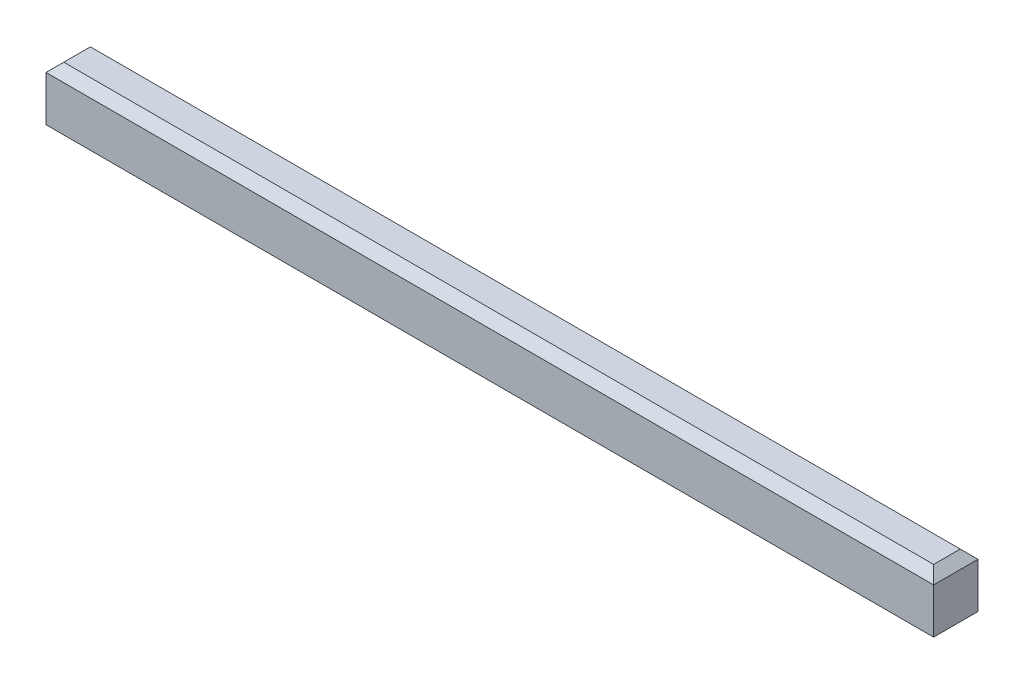
ISO-10303-21;
HEADER;
FILE_DESCRIPTION(('STEP AP214'),'2;1');
FILE_NAME('part.step','',(''),(''),'','','');
FILE_SCHEMA(('AUTOMOTIVE_DESIGN { 1 0 10303 214 1 1 1 1 }'));
ENDSEC;
DATA;
#1=APPLICATION_CONTEXT('core data for automotive mechanical design processes');
#2=APPLICATION_PROTOCOL_DEFINITION('international standard','automotive_design',2000,#1);
#3=PRODUCT_CONTEXT('',#1,'mechanical');
#4=PRODUCT('Part','Part','',(#3));
#5=PRODUCT_RELATED_PRODUCT_CATEGORY('part','',(#4));
#6=PRODUCT_DEFINITION_FORMATION('','',#4);
#7=PRODUCT_DEFINITION_CONTEXT('part definition',#1,'design');
#8=PRODUCT_DEFINITION('design','',#6,#7);
#9=PRODUCT_DEFINITION_SHAPE('','',#8);
#10=(LENGTH_UNIT() NAMED_UNIT(*) SI_UNIT(.MILLI.,.METRE.));
#11=(NAMED_UNIT(*) PLANE_ANGLE_UNIT() SI_UNIT($,.RADIAN.));
#12=(NAMED_UNIT(*) SI_UNIT($,.STERADIAN.) SOLID_ANGLE_UNIT());
#13=UNCERTAINTY_MEASURE_WITH_UNIT(LENGTH_MEASURE(1.E-05),#10,'distance_accuracy_value','');
#14=(GEOMETRIC_REPRESENTATION_CONTEXT(3) GLOBAL_UNCERTAINTY_ASSIGNED_CONTEXT((#13)) GLOBAL_UNIT_ASSIGNED_CONTEXT((#10,
#11,#12)) REPRESENTATION_CONTEXT('',''));
#15=CARTESIAN_POINT('',(0.,0.,0.));
#16=DIRECTION('',(0.,0.,1.));
#17=DIRECTION('',(1.,0.,0.));
#18=AXIS2_PLACEMENT_3D('',#15,#16,#17);
#19=CARTESIAN_POINT('',(0.,0.,2.5));
#20=DIRECTION('',(1.,0.,0.));
#21=DIRECTION('',(0.,0.,-1.));
#22=AXIS2_PLACEMENT_3D('',#19,#20,#21);
#23=PLANE('',#22);
#24=DIRECTION('',(0.,-1.,0.));
#25=VECTOR('',#24,1.);
#26=CARTESIAN_POINT('',(0.,0.,2.5));
#27=LINE('',#26,#25);
#28=CARTESIAN_POINT('',(0.,5.1,2.5));
#29=VERTEX_POINT('',#28);
#30=CARTESIAN_POINT('',(0.,0.,2.5));
#31=VERTEX_POINT('',#30);
#32=EDGE_CURVE('E84',#29,#31,#27,.T.);
#33=ORIENTED_EDGE('',*,*,#32,.F.);
#34=DIRECTION('',(0.,0.,-1.));
#35=VECTOR('',#34,1.);
#36=CARTESIAN_POINT('',(0.,5.1,2.5));
#37=LINE('',#36,#35);
#38=CARTESIAN_POINT('',(0.,5.1,-2.5));
#39=VERTEX_POINT('',#38);
#40=EDGE_CURVE('E42',#29,#39,#37,.T.);
#41=ORIENTED_EDGE('',*,*,#40,.T.);
#42=DIRECTION('',(0.,-1.,0.));
#43=VECTOR('',#42,1.);
#44=CARTESIAN_POINT('',(0.,0.,-2.5));
#45=LINE('',#44,#43);
#46=CARTESIAN_POINT('',(0.,0.,-2.5));
#47=VERTEX_POINT('',#46);
#48=EDGE_CURVE('E101',#39,#47,#45,.T.);
#49=ORIENTED_EDGE('',*,*,#48,.T.);
#50=DIRECTION('',(0.,0.,-1.));
#51=VECTOR('',#50,1.);
#52=CARTESIAN_POINT('',(0.,0.,2.5));
#53=LINE('',#52,#51);
#54=EDGE_CURVE('E95',#31,#47,#53,.T.);
#55=ORIENTED_EDGE('',*,*,#54,.F.);
#56=EDGE_LOOP('',(#33,#41,#49,#55));
#57=FACE_BOUND('',#56,.T.);
#58=ADVANCED_FACE('F33',(#57),#23,.F.);
#59=CARTESIAN_POINT('',(0.,0.,2.5));
#60=DIRECTION('',(0.,1.,0.));
#61=DIRECTION('',(0.,0.,1.));
#62=AXIS2_PLACEMENT_3D('',#59,#60,#61);
#63=PLANE('',#62);
#64=DIRECTION('',(1.,0.,0.));
#65=VECTOR('',#64,1.);
#66=CARTESIAN_POINT('',(0.,0.,-2.5));
#67=LINE('',#66,#65);
#68=CARTESIAN_POINT('',(100.,0.,-2.5));
#69=VERTEX_POINT('',#68);
#70=EDGE_CURVE('E134',#47,#69,#67,.T.);
#71=ORIENTED_EDGE('',*,*,#70,.T.);
#72=DIRECTION('',(0.,0.,-1.));
#73=VECTOR('',#72,1.);
#74=CARTESIAN_POINT('',(100.,0.,2.5));
#75=LINE('',#74,#73);
#76=CARTESIAN_POINT('',(100.,0.,2.5));
#77=VERTEX_POINT('',#76);
#78=EDGE_CURVE('E97',#77,#69,#75,.T.);
#79=ORIENTED_EDGE('',*,*,#78,.F.);
#80=DIRECTION('',(1.,0.,0.));
#81=VECTOR('',#80,1.);
#82=CARTESIAN_POINT('',(0.,0.,2.5));
#83=LINE('',#82,#81);
#84=EDGE_CURVE('E87',#31,#77,#83,.T.);
#85=ORIENTED_EDGE('',*,*,#84,.F.);
#86=ORIENTED_EDGE('',*,*,#54,.T.);
#87=EDGE_LOOP('',(#71,#79,#85,#86));
#88=FACE_BOUND('',#87,.T.);
#89=ADVANCED_FACE('F94',(#88),#63,.F.);
#90=CARTESIAN_POINT('',(100.,0.,2.5));
#91=DIRECTION('',(-1.,0.,0.));
#92=DIRECTION('',(0.,0.,1.));
#93=AXIS2_PLACEMENT_3D('',#90,#91,#92);
#94=PLANE('',#93);
#95=DIRECTION('',(0.,1.,0.));
#96=VECTOR('',#95,1.);
#97=CARTESIAN_POINT('',(100.,0.,-2.5));
#98=LINE('',#97,#96);
#99=CARTESIAN_POINT('',(100.,5.1,-2.5));
#100=VERTEX_POINT('',#99);
#101=EDGE_CURVE('E90',#69,#100,#98,.T.);
#102=ORIENTED_EDGE('',*,*,#101,.T.);
#103=DIRECTION('',(0.,0.,1.));
#104=VECTOR('',#103,1.);
#105=CARTESIAN_POINT('',(100.,5.1,2.5));
#106=LINE('',#105,#104);
#107=CARTESIAN_POINT('',(100.,5.1,2.5));
#108=VERTEX_POINT('',#107);
#109=EDGE_CURVE('E116',#100,#108,#106,.T.);
#110=ORIENTED_EDGE('',*,*,#109,.T.);
#111=DIRECTION('',(0.,1.,0.));
#112=VECTOR('',#111,1.);
#113=CARTESIAN_POINT('',(100.,0.,2.5));
#114=LINE('',#113,#112);
#115=EDGE_CURVE('E99',#77,#108,#114,.T.);
#116=ORIENTED_EDGE('',*,*,#115,.F.);
#117=ORIENTED_EDGE('',*,*,#78,.T.);
#118=EDGE_LOOP('',(#102,#110,#116,#117));
#119=FACE_BOUND('',#118,.T.);
#120=ADVANCED_FACE('F142',(#119),#94,.F.);
#121=CARTESIAN_POINT('',(0.,6.1,2.5));
#122=DIRECTION('',(0.,-1.,0.));
#123=DIRECTION('',(0.,0.,-1.));
#124=AXIS2_PLACEMENT_3D('',#121,#122,#123);
#125=PLANE('',#124);
#126=DIRECTION('',(1.,0.,0.));
#127=VECTOR('',#126,1.);
#128=CARTESIAN_POINT('',(0.,6.1,1.5));
#129=LINE('',#128,#127);
#130=CARTESIAN_POINT('',(1.,6.1,1.5));
#131=VERTEX_POINT('',#130);
#132=CARTESIAN_POINT('',(99.,6.1,1.5));
#133=VERTEX_POINT('',#132);
#134=EDGE_CURVE('E111',#131,#133,#129,.T.);
#135=ORIENTED_EDGE('',*,*,#134,.T.);
#136=DIRECTION('',(0.,0.,-1.));
#137=VECTOR('',#136,1.);
#138=CARTESIAN_POINT('',(99.,6.1,2.5));
#139=LINE('',#138,#137);
#140=CARTESIAN_POINT('',(99.,6.1,-1.5));
#141=VERTEX_POINT('',#140);
#142=EDGE_CURVE('E113',#133,#141,#139,.T.);
#143=ORIENTED_EDGE('',*,*,#142,.T.);
#144=DIRECTION('',(-1.,0.,0.));
#145=VECTOR('',#144,1.);
#146=CARTESIAN_POINT('',(0.,6.1,-1.5));
#147=LINE('',#146,#145);
#148=CARTESIAN_POINT('',(1.,6.1,-1.5));
#149=VERTEX_POINT('',#148);
#150=EDGE_CURVE('E103',#141,#149,#147,.T.);
#151=ORIENTED_EDGE('',*,*,#150,.T.);
#152=DIRECTION('',(0.,0.,1.));
#153=VECTOR('',#152,1.);
#154=CARTESIAN_POINT('',(1.,6.1,2.5));
#155=LINE('',#154,#153);
#156=EDGE_CURVE('E105',#149,#131,#155,.T.);
#157=ORIENTED_EDGE('',*,*,#156,.T.);
#158=EDGE_LOOP('',(#135,#143,#151,#157));
#159=FACE_BOUND('',#158,.T.);
#160=ADVANCED_FACE('F152',(#159),#125,.F.);
#161=CARTESIAN_POINT('',(0.,0.,2.5));
#162=DIRECTION('',(0.,0.,-1.));
#163=DIRECTION('',(-1.,0.,0.));
#164=AXIS2_PLACEMENT_3D('',#161,#162,#163);
#165=PLANE('',#164);
#166=ORIENTED_EDGE('',*,*,#115,.T.);
#167=DIRECTION('',(-1.,0.,0.));
#168=VECTOR('',#167,1.);
#169=CARTESIAN_POINT('',(0.,5.1,2.5));
#170=LINE('',#169,#168);
#171=EDGE_CURVE('E57',#108,#29,#170,.T.);
#172=ORIENTED_EDGE('',*,*,#171,.T.);
#173=ORIENTED_EDGE('',*,*,#32,.T.);
#174=ORIENTED_EDGE('',*,*,#84,.T.);
#175=EDGE_LOOP('',(#166,#172,#173,#174));
#176=FACE_BOUND('',#175,.T.);
#177=ADVANCED_FACE('F86',(#176),#165,.F.);
#178=CARTESIAN_POINT('',(0.,0.,-2.5));
#179=DIRECTION('',(0.,0.,-1.));
#180=DIRECTION('',(-1.,0.,0.));
#181=AXIS2_PLACEMENT_3D('',#178,#179,#180);
#182=PLANE('',#181);
#183=ORIENTED_EDGE('',*,*,#48,.F.);
#184=DIRECTION('',(1.,0.,0.));
#185=VECTOR('',#184,1.);
#186=CARTESIAN_POINT('',(100.,5.1,-2.5));
#187=LINE('',#186,#185);
#188=EDGE_CURVE('E11',#39,#100,#187,.T.);
#189=ORIENTED_EDGE('',*,*,#188,.T.);
#190=ORIENTED_EDGE('',*,*,#101,.F.);
#191=ORIENTED_EDGE('',*,*,#70,.F.);
#192=EDGE_LOOP('',(#183,#189,#190,#191));
#193=FACE_BOUND('',#192,.T.);
#194=ADVANCED_FACE('F160',(#193),#182,.T.);
#195=CARTESIAN_POINT('',(0.,5.1,2.5));
#196=DIRECTION('',(0.707106781186547,-0.707106781186547,0.));
#197=DIRECTION('',(0.,0.,-1.));
#198=AXIS2_PLACEMENT_3D('',#195,#196,#197);
#199=PLANE('',#198);
#200=DIRECTION('',(-0.577350269189626,-0.577350269189626,-0.577350269189626));
#201=VECTOR('',#200,1.);
#202=CARTESIAN_POINT('',(0.666666666666667,5.76666666666667,-1.83333333333333));
#203=LINE('',#202,#201);
#204=EDGE_CURVE('E124',#39,#149,#203,.F.);
#205=ORIENTED_EDGE('',*,*,#204,.F.);
#206=ORIENTED_EDGE('',*,*,#40,.F.);
#207=DIRECTION('',(0.577350269189626,0.577350269189626,-0.577350269189626));
#208=VECTOR('',#207,1.);
#209=CARTESIAN_POINT('',(0.,5.1,2.5));
#210=LINE('',#209,#208);
#211=EDGE_CURVE('E37',#131,#29,#210,.F.);
#212=ORIENTED_EDGE('',*,*,#211,.F.);
#213=ORIENTED_EDGE('',*,*,#156,.F.);
#214=EDGE_LOOP('',(#205,#206,#212,#213));
#215=FACE_BOUND('',#214,.T.);
#216=ADVANCED_FACE('F35',(#215),#199,.F.);
#217=CARTESIAN_POINT('',(0.,5.1,2.5));
#218=DIRECTION('',(0.,-0.707106781186547,-0.707106781186547));
#219=DIRECTION('',(-1.,0.,0.));
#220=AXIS2_PLACEMENT_3D('',#217,#218,#219);
#221=PLANE('',#220);
#222=ORIENTED_EDGE('',*,*,#211,.T.);
#223=ORIENTED_EDGE('',*,*,#171,.F.);
#224=DIRECTION('',(-0.577350269189626,0.577350269189626,-0.577350269189626));
#225=VECTOR('',#224,1.);
#226=CARTESIAN_POINT('',(66.6666666666667,38.4333333333333,-30.8333333333333));
#227=LINE('',#226,#225);
#228=EDGE_CURVE('E123',#133,#108,#227,.F.);
#229=ORIENTED_EDGE('',*,*,#228,.F.);
#230=ORIENTED_EDGE('',*,*,#134,.F.);
#231=EDGE_LOOP('',(#222,#223,#229,#230));
#232=FACE_BOUND('',#231,.T.);
#233=ADVANCED_FACE('F153',(#232),#221,.F.);
#234=CARTESIAN_POINT('',(0.,6.1,-1.5));
#235=DIRECTION('',(0.,0.707106781186547,-0.707106781186547));
#236=DIRECTION('',(1.,0.,0.));
#237=AXIS2_PLACEMENT_3D('',#234,#235,#236);
#238=PLANE('',#237);
#239=ORIENTED_EDGE('',*,*,#204,.T.);
#240=ORIENTED_EDGE('',*,*,#150,.F.);
#241=DIRECTION('',(-0.577350269189626,0.577350269189626,0.577350269189626));
#242=VECTOR('',#241,1.);
#243=CARTESIAN_POINT('',(66.,39.1,31.5));
#244=LINE('',#243,#242);
#245=EDGE_CURVE('E121',#100,#141,#244,.T.);
#246=ORIENTED_EDGE('',*,*,#245,.F.);
#247=ORIENTED_EDGE('',*,*,#188,.F.);
#248=EDGE_LOOP('',(#239,#240,#246,#247));
#249=FACE_BOUND('',#248,.T.);
#250=ADVANCED_FACE('F149',(#249),#238,.T.);
#251=CARTESIAN_POINT('',(99.,6.1,2.5));
#252=DIRECTION('',(-0.707106781186547,-0.707106781186547,0.));
#253=DIRECTION('',(0.,0.,-1.));
#254=AXIS2_PLACEMENT_3D('',#251,#252,#253);
#255=PLANE('',#254);
#256=ORIENTED_EDGE('',*,*,#228,.T.);
#257=ORIENTED_EDGE('',*,*,#109,.F.);
#258=ORIENTED_EDGE('',*,*,#245,.T.);
#259=ORIENTED_EDGE('',*,*,#142,.F.);
#260=EDGE_LOOP('',(#256,#257,#258,#259));
#261=FACE_BOUND('',#260,.T.);
#262=ADVANCED_FACE('F146',(#261),#255,.F.);
#263=CLOSED_SHELL('',(#58,#89,#120,#160,#177,#194,#216,#233,#250,#262));
#264=MANIFOLD_SOLID_BREP('B2',#263);
#265=ADVANCED_BREP_SHAPE_REPRESENTATION('',(#18,#264),#14);
#266=SHAPE_DEFINITION_REPRESENTATION(#9,#265);
ENDSEC;
END-ISO-10303-21;
